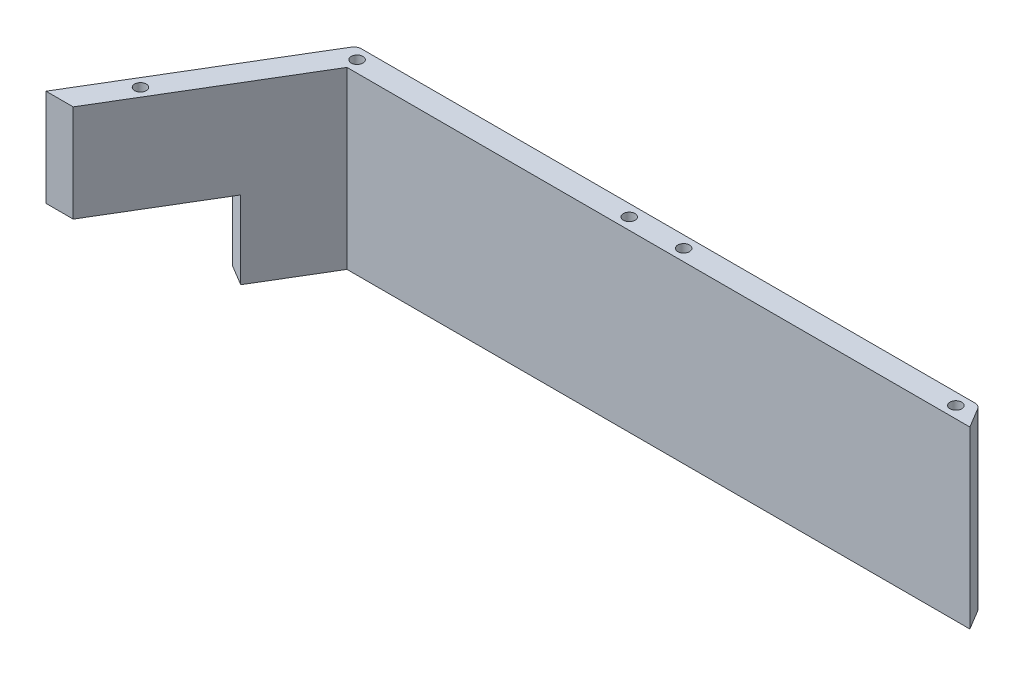
ISO-10303-21;
HEADER;
FILE_DESCRIPTION(('STEP AP214'),'2;1');
FILE_NAME('part.step','',(''),(''),'','','');
FILE_SCHEMA(('AUTOMOTIVE_DESIGN { 1 0 10303 214 1 1 1 1 }'));
ENDSEC;
DATA;
#1=APPLICATION_CONTEXT('core data for automotive mechanical design processes');
#2=APPLICATION_PROTOCOL_DEFINITION('international standard','automotive_design',2000,#1);
#3=PRODUCT_CONTEXT('',#1,'mechanical');
#4=PRODUCT('Part','Part','',(#3));
#5=PRODUCT_RELATED_PRODUCT_CATEGORY('part','',(#4));
#6=PRODUCT_DEFINITION_FORMATION('','',#4);
#7=PRODUCT_DEFINITION_CONTEXT('part definition',#1,'design');
#8=PRODUCT_DEFINITION('design','',#6,#7);
#9=PRODUCT_DEFINITION_SHAPE('','',#8);
#10=(LENGTH_UNIT() NAMED_UNIT(*) SI_UNIT(.MILLI.,.METRE.));
#11=(NAMED_UNIT(*) PLANE_ANGLE_UNIT() SI_UNIT($,.RADIAN.));
#12=(NAMED_UNIT(*) SI_UNIT($,.STERADIAN.) SOLID_ANGLE_UNIT());
#13=UNCERTAINTY_MEASURE_WITH_UNIT(LENGTH_MEASURE(1.E-05),#10,'distance_accuracy_value','');
#14=(GEOMETRIC_REPRESENTATION_CONTEXT(3) GLOBAL_UNCERTAINTY_ASSIGNED_CONTEXT((#13)) GLOBAL_UNIT_ASSIGNED_CONTEXT((#10,
#11,#12)) REPRESENTATION_CONTEXT('',''));
#15=CARTESIAN_POINT('',(0.,0.,0.));
#16=DIRECTION('',(0.,0.,1.));
#17=DIRECTION('',(1.,0.,0.));
#18=AXIS2_PLACEMENT_3D('',#15,#16,#17);
#19=CARTESIAN_POINT('',(0.,-22.5,0.));
#20=DIRECTION('',(0.,-1.,0.));
#21=DIRECTION('',(0.,0.,-1.));
#22=AXIS2_PLACEMENT_3D('',#19,#20,#21);
#23=PLANE('',#22);
#24=DIRECTION('',(-0.514495755427526,0.,-0.857492925712544));
#25=VECTOR('',#24,1.);
#26=CARTESIAN_POINT('',(110.,-22.5,1.76566830699974E-13));
#27=LINE('',#26,#25);
#28=CARTESIAN_POINT('',(83.6,-22.5,-43.9999999999998));
#29=VERTEX_POINT('',#28);
#30=CARTESIAN_POINT('',(80.582605093487,-22.5,-49.0289915108549));
#31=VERTEX_POINT('',#30);
#32=EDGE_CURVE('E146',#29,#31,#27,.T.);
#33=ORIENTED_EDGE('',*,*,#32,.F.);
#34=DIRECTION('',(1.,0.,0.));
#35=VECTOR('',#34,1.);
#36=CARTESIAN_POINT('',(76.6,-22.5,-43.9999999999998));
#37=LINE('',#36,#35);
#38=CARTESIAN_POINT('',(-76.6,-22.5,-43.9999999999998));
#39=VERTEX_POINT('',#38);
#40=EDGE_CURVE('E53',#39,#29,#37,.T.);
#41=ORIENTED_EDGE('',*,*,#40,.F.);
#42=DIRECTION('',(0.514495755427526,0.,-0.857492925712545));
#43=VECTOR('',#42,1.);
#44=CARTESIAN_POINT('',(-76.6,-22.5,-43.9999999999998));
#45=LINE('',#44,#43);
#46=CARTESIAN_POINT('',(-86.8455897365072,-22.5,-26.9240171058212));
#47=VERTEX_POINT('',#46);
#48=EDGE_CURVE('E143',#47,#39,#45,.T.);
#49=ORIENTED_EDGE('',*,*,#48,.F.);
#50=DIRECTION('',(-0.857492925712544,0.,-0.514495755427526));
#51=VECTOR('',#50,1.);
#52=CARTESIAN_POINT('',(-83.4177193029112,-22.5,-24.8672948456636));
#53=LINE('',#52,#51);
#54=CARTESIAN_POINT('',(-91.9926485600366,-22.5,-30.0122523999389));
#55=VERTEX_POINT('',#54);
#56=EDGE_CURVE('E50',#47,#55,#53,.T.);
#57=ORIENTED_EDGE('',*,*,#56,.T.);
#58=DIRECTION('',(-0.514495755427526,0.,0.857492925712544));
#59=VECTOR('',#58,1.);
#60=CARTESIAN_POINT('',(-110.,-22.5,1.76566830699974E-13));
#61=LINE('',#60,#59);
#62=CARTESIAN_POINT('',(-80.582605093487,-22.5,-49.0289915108549));
#63=VERTEX_POINT('',#62);
#64=EDGE_CURVE('E153',#63,#55,#61,.T.);
#65=ORIENTED_EDGE('',*,*,#64,.F.);
#66=CARTESIAN_POINT('',(-78.8676192420619,-22.5,-47.9999999999998));
#67=DIRECTION('',(0.,-1.,0.));
#68=DIRECTION('',(0.,0.,-1.));
#69=AXIS2_PLACEMENT_3D('',#66,#67,#68);
#70=CIRCLE('',#69,2.);
#71=CARTESIAN_POINT('',(-78.8676192420619,-22.5,-49.9999999999998));
#72=VERTEX_POINT('',#71);
#73=EDGE_CURVE('E167',#63,#72,#70,.T.);
#74=ORIENTED_EDGE('',*,*,#73,.T.);
#75=DIRECTION('',(-1.,0.,0.));
#76=VECTOR('',#75,1.);
#77=CARTESIAN_POINT('',(-80.,-22.5,-49.9999999999998));
#78=LINE('',#77,#76);
#79=CARTESIAN_POINT('',(78.8676192420619,-22.5,-49.9999999999998));
#80=VERTEX_POINT('',#79);
#81=EDGE_CURVE('E151',#80,#72,#78,.T.);
#82=ORIENTED_EDGE('',*,*,#81,.F.);
#83=CARTESIAN_POINT('',(78.8676192420619,-22.5,-47.9999999999998));
#84=DIRECTION('',(0.,-1.,0.));
#85=DIRECTION('',(0.,0.,-1.));
#86=AXIS2_PLACEMENT_3D('',#83,#84,#85);
#87=CIRCLE('',#86,2.);
#88=EDGE_CURVE('E175',#80,#31,#87,.T.);
#89=ORIENTED_EDGE('',*,*,#88,.T.);
#90=EDGE_LOOP('',(#33,#41,#49,#57,#65,#74,#82,#89));
#91=FACE_BOUND('',#90,.T.);
#92=ADVANCED_FACE('F39',(#91),#23,.T.);
#93=CARTESIAN_POINT('',(110.,22.5,1.76566830699974E-13));
#94=DIRECTION('',(-0.857492925712544,0.,0.514495755427526));
#95=DIRECTION('',(0.514495755427526,0.,0.857492925712544));
#96=AXIS2_PLACEMENT_3D('',#93,#94,#95);
#97=PLANE('',#96);
#98=DIRECTION('',(0.,1.,0.));
#99=VECTOR('',#98,1.);
#100=CARTESIAN_POINT('',(83.6,22.5,-43.9999999999998));
#101=LINE('',#100,#99);
#102=CARTESIAN_POINT('',(83.6,22.5,-43.9999999999998));
#103=VERTEX_POINT('',#102);
#104=EDGE_CURVE('E127',#29,#103,#101,.T.);
#105=ORIENTED_EDGE('',*,*,#104,.F.);
#106=ORIENTED_EDGE('',*,*,#32,.T.);
#107=DIRECTION('',(0.,-1.,0.));
#108=VECTOR('',#107,1.);
#109=CARTESIAN_POINT('',(80.582605093487,22.5,-49.0289915108549));
#110=LINE('',#109,#108);
#111=CARTESIAN_POINT('',(80.582605093487,22.5,-49.0289915108549));
#112=VERTEX_POINT('',#111);
#113=EDGE_CURVE('E133',#31,#112,#110,.F.);
#114=ORIENTED_EDGE('',*,*,#113,.T.);
#115=DIRECTION('',(-0.514495755427526,0.,-0.857492925712544));
#116=VECTOR('',#115,1.);
#117=CARTESIAN_POINT('',(110.,22.5,1.76566830699974E-13));
#118=LINE('',#117,#116);
#119=EDGE_CURVE('E119',#103,#112,#118,.T.);
#120=ORIENTED_EDGE('',*,*,#119,.F.);
#121=EDGE_LOOP('',(#105,#106,#114,#120));
#122=FACE_BOUND('',#121,.T.);
#123=ADVANCED_FACE('F132',(#122),#97,.F.);
#124=CARTESIAN_POINT('',(0.,22.5,0.));
#125=DIRECTION('',(0.,-1.,0.));
#126=DIRECTION('',(0.,0.,-1.));
#127=AXIS2_PLACEMENT_3D('',#124,#125,#126);
#128=PLANE('',#127);
#129=CARTESIAN_POINT('',(77.,22.5,-46.9999999999998));
#130=DIRECTION('',(0.,1.,0.));
#131=DIRECTION('',(0.,0.,-1.));
#132=AXIS2_PLACEMENT_3D('',#129,#130,#131);
#133=CIRCLE('',#132,1.5);
#134=CARTESIAN_POINT('',(77.,22.5,-48.4999999999998));
#135=VERTEX_POINT('',#134);
#136=EDGE_CURVE('E225',#135,#135,#133,.T.);
#137=ORIENTED_EDGE('',*,*,#136,.F.);
#138=EDGE_LOOP('',(#137));
#139=FACE_BOUND('',#138,.T.);
#140=CARTESIAN_POINT('',(7.00000000000001,22.5,-46.9999999999998));
#141=DIRECTION('',(0.,1.,0.));
#142=DIRECTION('',(0.,0.,-1.));
#143=AXIS2_PLACEMENT_3D('',#140,#141,#142);
#144=CIRCLE('',#143,1.5);
#145=CARTESIAN_POINT('',(7.00000000000001,22.5,-48.4999999999998));
#146=VERTEX_POINT('',#145);
#147=EDGE_CURVE('E216',#146,#146,#144,.T.);
#148=ORIENTED_EDGE('',*,*,#147,.F.);
#149=EDGE_LOOP('',(#148));
#150=FACE_BOUND('',#149,.T.);
#151=CARTESIAN_POINT('',(-7.00000000000001,22.5,-46.9999999999998));
#152=DIRECTION('',(0.,1.,0.));
#153=DIRECTION('',(0.,0.,1.));
#154=AXIS2_PLACEMENT_3D('',#151,#152,#153);
#155=CIRCLE('',#154,1.5);
#156=CARTESIAN_POINT('',(-7.00000000000001,22.5,-45.4999999999998));
#157=VERTEX_POINT('',#156);
#158=EDGE_CURVE('E208',#157,#157,#155,.T.);
#159=ORIENTED_EDGE('',*,*,#158,.F.);
#160=EDGE_LOOP('',(#159));
#161=FACE_BOUND('',#160,.T.);
#162=CARTESIAN_POINT('',(-77.,22.5,-46.9999999999998));
#163=DIRECTION('',(0.,1.,0.));
#164=DIRECTION('',(0.,0.,1.));
#165=AXIS2_PLACEMENT_3D('',#162,#163,#164);
#166=CIRCLE('',#165,1.5);
#167=CARTESIAN_POINT('',(-77.,22.5,-45.4999999999998));
#168=VERTEX_POINT('',#167);
#169=EDGE_CURVE('E203',#168,#168,#166,.T.);
#170=ORIENTED_EDGE('',*,*,#169,.F.);
#171=EDGE_LOOP('',(#170));
#172=FACE_BOUND('',#171,.T.);
#173=CARTESIAN_POINT('',(-98.7014288630928,22.5,-12.9999999999998));
#174=DIRECTION('',(0.,1.,0.));
#175=DIRECTION('',(0.,0.,1.));
#176=AXIS2_PLACEMENT_3D('',#173,#174,#175);
#177=CIRCLE('',#176,1.5);
#178=CARTESIAN_POINT('',(-98.7014288630928,22.5,-11.4999999999998));
#179=VERTEX_POINT('',#178);
#180=EDGE_CURVE('E201',#179,#179,#177,.T.);
#181=ORIENTED_EDGE('',*,*,#180,.F.);
#182=EDGE_LOOP('',(#181));
#183=FACE_BOUND('',#182,.T.);
#184=DIRECTION('',(1.,0.,0.));
#185=VECTOR('',#184,1.);
#186=CARTESIAN_POINT('',(76.6,22.5,-43.9999999999998));
#187=LINE('',#186,#185);
#188=CARTESIAN_POINT('',(-76.6,22.5,-43.9999999999998));
#189=VERTEX_POINT('',#188);
#190=EDGE_CURVE('E120',#189,#103,#187,.T.);
#191=ORIENTED_EDGE('',*,*,#190,.T.);
#192=ORIENTED_EDGE('',*,*,#119,.T.);
#193=CARTESIAN_POINT('',(78.8676192420619,22.5,-47.9999999999998));
#194=DIRECTION('',(0.,-1.,0.));
#195=DIRECTION('',(0.,0.,-1.));
#196=AXIS2_PLACEMENT_3D('',#193,#194,#195);
#197=CIRCLE('',#196,2.);
#198=CARTESIAN_POINT('',(78.8676192420619,22.5,-49.9999999999998));
#199=VERTEX_POINT('',#198);
#200=EDGE_CURVE('E178',#112,#199,#197,.F.);
#201=ORIENTED_EDGE('',*,*,#200,.T.);
#202=DIRECTION('',(-1.,0.,0.));
#203=VECTOR('',#202,1.);
#204=CARTESIAN_POINT('',(-80.,22.5,-49.9999999999998));
#205=LINE('',#204,#203);
#206=CARTESIAN_POINT('',(-78.8676192420619,22.5,-49.9999999999998));
#207=VERTEX_POINT('',#206);
#208=EDGE_CURVE('E136',#199,#207,#205,.T.);
#209=ORIENTED_EDGE('',*,*,#208,.T.);
#210=CARTESIAN_POINT('',(-78.8676192420619,22.5,-47.9999999999998));
#211=DIRECTION('',(0.,-1.,0.));
#212=DIRECTION('',(0.,0.,-1.));
#213=AXIS2_PLACEMENT_3D('',#210,#211,#212);
#214=CIRCLE('',#213,2.);
#215=CARTESIAN_POINT('',(-80.582605093487,22.5,-49.0289915108549));
#216=VERTEX_POINT('',#215);
#217=EDGE_CURVE('E176',#207,#216,#214,.F.);
#218=ORIENTED_EDGE('',*,*,#217,.T.);
#219=DIRECTION('',(-0.514495755427526,0.,0.857492925712544));
#220=VECTOR('',#219,1.);
#221=CARTESIAN_POINT('',(-110.,22.5,1.76566830699974E-13));
#222=LINE('',#221,#220);
#223=CARTESIAN_POINT('',(-110.,22.5,1.76566830699974E-13));
#224=VERTEX_POINT('',#223);
#225=EDGE_CURVE('E138',#216,#224,#222,.T.);
#226=ORIENTED_EDGE('',*,*,#225,.T.);
#227=DIRECTION('',(1.,0.,0.));
#228=VECTOR('',#227,1.);
#229=CARTESIAN_POINT('',(-103.,22.5,1.75709577940571E-13));
#230=LINE('',#229,#228);
#231=CARTESIAN_POINT('',(-103.,22.5,1.75709577940571E-13));
#232=VERTEX_POINT('',#231);
#233=EDGE_CURVE('E160',#224,#232,#230,.T.);
#234=ORIENTED_EDGE('',*,*,#233,.T.);
#235=DIRECTION('',(0.514495755427526,0.,-0.857492925712545));
#236=VECTOR('',#235,1.);
#237=CARTESIAN_POINT('',(-76.6,22.5,-43.9999999999998));
#238=LINE('',#237,#236);
#239=EDGE_CURVE('E124',#232,#189,#238,.T.);
#240=ORIENTED_EDGE('',*,*,#239,.T.);
#241=EDGE_LOOP('',(#191,#192,#201,#209,#218,#226,#234,#240));
#242=FACE_BOUND('',#241,.T.);
#243=ADVANCED_FACE('F117',(#139,#150,#161,#172,#183,#242),#128,.F.);
#244=CARTESIAN_POINT('',(-110.,22.5,1.76566830699974E-13));
#245=DIRECTION('',(0.857492925712544,0.,0.514495755427526));
#246=DIRECTION('',(0.514495755427526,0.,-0.857492925712544));
#247=AXIS2_PLACEMENT_3D('',#244,#245,#246);
#248=PLANE('',#247);
#249=DIRECTION('',(0.,-1.,0.));
#250=VECTOR('',#249,1.);
#251=CARTESIAN_POINT('',(-91.9926485600366,-22.5,-30.0122523999389));
#252=LINE('',#251,#250);
#253=CARTESIAN_POINT('',(-91.9926485600366,-2.50000000000001,-30.0122523999389));
#254=VERTEX_POINT('',#253);
#255=EDGE_CURVE('E128',#254,#55,#252,.T.);
#256=ORIENTED_EDGE('',*,*,#255,.F.);
#257=DIRECTION('',(0.514495755427526,0.,-0.857492925712544));
#258=VECTOR('',#257,1.);
#259=CARTESIAN_POINT('',(-110.,-2.5,1.73472347597681E-13));
#260=LINE('',#259,#258);
#261=CARTESIAN_POINT('',(-110.,-2.5,1.73472347597681E-13));
#262=VERTEX_POINT('',#261);
#263=EDGE_CURVE('E250',#262,#254,#260,.T.);
#264=ORIENTED_EDGE('',*,*,#263,.F.);
#265=DIRECTION('',(0.,-1.,0.));
#266=VECTOR('',#265,1.);
#267=CARTESIAN_POINT('',(-110.,22.5,1.76566830699974E-13));
#268=LINE('',#267,#266);
#269=EDGE_CURVE('E144',#224,#262,#268,.T.);
#270=ORIENTED_EDGE('',*,*,#269,.F.);
#271=ORIENTED_EDGE('',*,*,#225,.F.);
#272=DIRECTION('',(0.,-1.,0.));
#273=VECTOR('',#272,1.);
#274=CARTESIAN_POINT('',(-80.582605093487,22.5,-49.0289915108549));
#275=LINE('',#274,#273);
#276=EDGE_CURVE('E177',#216,#63,#275,.T.);
#277=ORIENTED_EDGE('',*,*,#276,.T.);
#278=ORIENTED_EDGE('',*,*,#64,.T.);
#279=EDGE_LOOP('',(#256,#264,#270,#271,#277,#278));
#280=FACE_BOUND('',#279,.T.);
#281=ADVANCED_FACE('F244',(#280),#248,.F.);
#282=CARTESIAN_POINT('',(-103.,22.5,1.75709577940571E-13));
#283=DIRECTION('',(0.,0.,-1.));
#284=DIRECTION('',(-1.,0.,0.));
#285=AXIS2_PLACEMENT_3D('',#282,#283,#284);
#286=PLANE('',#285);
#287=ORIENTED_EDGE('',*,*,#269,.T.);
#288=DIRECTION('',(1.,0.,0.));
#289=VECTOR('',#288,1.);
#290=CARTESIAN_POINT('',(-103.,-2.5,1.75709577940571E-13));
#291=LINE('',#290,#289);
#292=CARTESIAN_POINT('',(-103.,-2.5,1.73472347597681E-13));
#293=VERTEX_POINT('',#292);
#294=EDGE_CURVE('E193',#262,#293,#291,.T.);
#295=ORIENTED_EDGE('',*,*,#294,.T.);
#296=DIRECTION('',(0.,-1.,0.));
#297=VECTOR('',#296,1.);
#298=CARTESIAN_POINT('',(-103.,22.5,1.75709577940571E-13));
#299=LINE('',#298,#297);
#300=EDGE_CURVE('E162',#232,#293,#299,.T.);
#301=ORIENTED_EDGE('',*,*,#300,.F.);
#302=ORIENTED_EDGE('',*,*,#233,.F.);
#303=EDGE_LOOP('',(#287,#295,#301,#302));
#304=FACE_BOUND('',#303,.T.);
#305=ADVANCED_FACE('F233',(#304),#286,.F.);
#306=CARTESIAN_POINT('',(-76.6,22.5,-43.9999999999998));
#307=DIRECTION('',(-0.857492925712545,0.,-0.514495755427526));
#308=DIRECTION('',(-0.514495755427526,0.,0.857492925712545));
#309=AXIS2_PLACEMENT_3D('',#306,#307,#308);
#310=PLANE('',#309);
#311=DIRECTION('',(0.514495755427526,0.,-0.857492925712545));
#312=VECTOR('',#311,1.);
#313=CARTESIAN_POINT('',(-76.6,-2.50000000000001,-43.9999999999998));
#314=LINE('',#313,#312);
#315=CARTESIAN_POINT('',(-86.8455897365072,-2.50000000000001,-26.9240171058212));
#316=VERTEX_POINT('',#315);
#317=EDGE_CURVE('E11',#293,#316,#314,.T.);
#318=ORIENTED_EDGE('',*,*,#317,.T.);
#319=DIRECTION('',(0.,-1.,0.));
#320=VECTOR('',#319,1.);
#321=CARTESIAN_POINT('',(-86.8455897365072,22.5,-26.9240171058212));
#322=LINE('',#321,#320);
#323=EDGE_CURVE('E195',#316,#47,#322,.T.);
#324=ORIENTED_EDGE('',*,*,#323,.T.);
#325=ORIENTED_EDGE('',*,*,#48,.T.);
#326=DIRECTION('',(0.,-1.,0.));
#327=VECTOR('',#326,1.);
#328=CARTESIAN_POINT('',(-76.6,22.5,-43.9999999999998));
#329=LINE('',#328,#327);
#330=EDGE_CURVE('E159',#189,#39,#329,.T.);
#331=ORIENTED_EDGE('',*,*,#330,.F.);
#332=ORIENTED_EDGE('',*,*,#239,.F.);
#333=ORIENTED_EDGE('',*,*,#300,.T.);
#334=EDGE_LOOP('',(#318,#324,#325,#331,#332,#333));
#335=FACE_BOUND('',#334,.T.);
#336=ADVANCED_FACE('F231',(#335),#310,.F.);
#337=CARTESIAN_POINT('',(76.6,22.5,-43.9999999999998));
#338=DIRECTION('',(0.,0.,-1.));
#339=DIRECTION('',(-1.,0.,0.));
#340=AXIS2_PLACEMENT_3D('',#337,#338,#339);
#341=PLANE('',#340);
#342=ORIENTED_EDGE('',*,*,#40,.T.);
#343=ORIENTED_EDGE('',*,*,#104,.T.);
#344=ORIENTED_EDGE('',*,*,#190,.F.);
#345=ORIENTED_EDGE('',*,*,#330,.T.);
#346=EDGE_LOOP('',(#342,#343,#344,#345));
#347=FACE_BOUND('',#346,.T.);
#348=ADVANCED_FACE('F130',(#347),#341,.F.);
#349=CARTESIAN_POINT('',(-80.,22.5,-49.9999999999998));
#350=DIRECTION('',(0.,0.,1.));
#351=DIRECTION('',(1.,0.,0.));
#352=AXIS2_PLACEMENT_3D('',#349,#350,#351);
#353=PLANE('',#352);
#354=ORIENTED_EDGE('',*,*,#208,.F.);
#355=DIRECTION('',(0.,-1.,0.));
#356=VECTOR('',#355,1.);
#357=CARTESIAN_POINT('',(78.8676192420619,22.5,-49.9999999999998));
#358=LINE('',#357,#356);
#359=EDGE_CURVE('E170',#199,#80,#358,.T.);
#360=ORIENTED_EDGE('',*,*,#359,.T.);
#361=ORIENTED_EDGE('',*,*,#81,.T.);
#362=DIRECTION('',(0.,-1.,0.));
#363=VECTOR('',#362,1.);
#364=CARTESIAN_POINT('',(-78.8676192420619,22.5,-49.9999999999998));
#365=LINE('',#364,#363);
#366=EDGE_CURVE('E164',#72,#207,#365,.F.);
#367=ORIENTED_EDGE('',*,*,#366,.T.);
#368=EDGE_LOOP('',(#354,#360,#361,#367));
#369=FACE_BOUND('',#368,.T.);
#370=ADVANCED_FACE('F241',(#369),#353,.F.);
#371=CARTESIAN_POINT('',(77.,17.5,-46.9999999999998));
#372=DIRECTION('',(0.,1.,0.));
#373=DIRECTION('',(0.,0.,1.));
#374=AXIS2_PLACEMENT_3D('',#371,#372,#373);
#375=CYLINDRICAL_SURFACE('',#374,1.5);
#376=CARTESIAN_POINT('',(77.,17.5,-46.9999999999998));
#377=DIRECTION('',(0.,1.,0.));
#378=DIRECTION('',(0.,0.,-1.));
#379=AXIS2_PLACEMENT_3D('',#376,#377,#378);
#380=CIRCLE('',#379,1.5);
#381=CARTESIAN_POINT('',(77.,17.5,-48.4999999999998));
#382=VERTEX_POINT('',#381);
#383=EDGE_CURVE('E199',#382,#382,#380,.T.);
#384=ORIENTED_EDGE('',*,*,#383,.F.);
#385=EDGE_LOOP('',(#384));
#386=FACE_BOUND('',#385,.T.);
#387=ORIENTED_EDGE('',*,*,#136,.T.);
#388=EDGE_LOOP('',(#387));
#389=FACE_BOUND('',#388,.T.);
#390=ADVANCED_FACE('F272',(#386,#389),#375,.F.);
#391=CARTESIAN_POINT('',(77.,17.5,-46.9999999999998));
#392=DIRECTION('',(0.,-1.,0.));
#393=DIRECTION('',(0.,0.,-1.));
#394=AXIS2_PLACEMENT_3D('',#391,#392,#393);
#395=PLANE('',#394);
#396=ORIENTED_EDGE('',*,*,#383,.T.);
#397=EDGE_LOOP('',(#396));
#398=FACE_BOUND('',#397,.T.);
#399=ADVANCED_FACE('F315',(#398),#395,.F.);
#400=CARTESIAN_POINT('',(7.00000000000001,17.5,-46.9999999999998));
#401=DIRECTION('',(0.,1.,0.));
#402=DIRECTION('',(0.,0.,1.));
#403=AXIS2_PLACEMENT_3D('',#400,#401,#402);
#404=CYLINDRICAL_SURFACE('',#403,1.5);
#405=CARTESIAN_POINT('',(7.00000000000001,17.5,-46.9999999999998));
#406=DIRECTION('',(0.,1.,0.));
#407=DIRECTION('',(0.,0.,-1.));
#408=AXIS2_PLACEMENT_3D('',#405,#406,#407);
#409=CIRCLE('',#408,1.5);
#410=CARTESIAN_POINT('',(7.00000000000001,17.5,-48.4999999999998));
#411=VERTEX_POINT('',#410);
#412=EDGE_CURVE('E218',#411,#411,#409,.T.);
#413=ORIENTED_EDGE('',*,*,#412,.F.);
#414=EDGE_LOOP('',(#413));
#415=FACE_BOUND('',#414,.T.);
#416=ORIENTED_EDGE('',*,*,#147,.T.);
#417=EDGE_LOOP('',(#416));
#418=FACE_BOUND('',#417,.T.);
#419=ADVANCED_FACE('F307',(#415,#418),#404,.F.);
#420=CARTESIAN_POINT('',(7.00000000000001,17.5,-46.9999999999998));
#421=DIRECTION('',(0.,-1.,0.));
#422=DIRECTION('',(0.,0.,-1.));
#423=AXIS2_PLACEMENT_3D('',#420,#421,#422);
#424=PLANE('',#423);
#425=ORIENTED_EDGE('',*,*,#412,.T.);
#426=EDGE_LOOP('',(#425));
#427=FACE_BOUND('',#426,.T.);
#428=ADVANCED_FACE('F302',(#427),#424,.F.);
#429=CARTESIAN_POINT('',(-7.00000000000001,17.5,-46.9999999999998));
#430=DIRECTION('',(0.,1.,0.));
#431=DIRECTION('',(0.,0.,1.));
#432=AXIS2_PLACEMENT_3D('',#429,#430,#431);
#433=CYLINDRICAL_SURFACE('',#432,1.5);
#434=CARTESIAN_POINT('',(-7.00000000000001,17.5,-46.9999999999998));
#435=DIRECTION('',(0.,1.,0.));
#436=DIRECTION('',(0.,0.,1.));
#437=AXIS2_PLACEMENT_3D('',#434,#435,#436);
#438=CIRCLE('',#437,1.5);
#439=CARTESIAN_POINT('',(-7.00000000000001,17.5,-45.4999999999998));
#440=VERTEX_POINT('',#439);
#441=EDGE_CURVE('E214',#440,#440,#438,.T.);
#442=ORIENTED_EDGE('',*,*,#441,.F.);
#443=EDGE_LOOP('',(#442));
#444=FACE_BOUND('',#443,.T.);
#445=ORIENTED_EDGE('',*,*,#158,.T.);
#446=EDGE_LOOP('',(#445));
#447=FACE_BOUND('',#446,.T.);
#448=ADVANCED_FACE('F301',(#444,#447),#433,.F.);
#449=CARTESIAN_POINT('',(-7.00000000000001,17.5,-46.9999999999998));
#450=DIRECTION('',(0.,1.,0.));
#451=DIRECTION('',(0.,0.,1.));
#452=AXIS2_PLACEMENT_3D('',#449,#450,#451);
#453=PLANE('',#452);
#454=ORIENTED_EDGE('',*,*,#441,.T.);
#455=EDGE_LOOP('',(#454));
#456=FACE_BOUND('',#455,.T.);
#457=ADVANCED_FACE('F298',(#456),#453,.T.);
#458=CARTESIAN_POINT('',(-77.,17.5,-46.9999999999998));
#459=DIRECTION('',(0.,1.,0.));
#460=DIRECTION('',(0.,0.,1.));
#461=AXIS2_PLACEMENT_3D('',#458,#459,#460);
#462=CYLINDRICAL_SURFACE('',#461,1.5);
#463=CARTESIAN_POINT('',(-77.,17.5,-46.9999999999998));
#464=DIRECTION('',(0.,1.,0.));
#465=DIRECTION('',(0.,0.,1.));
#466=AXIS2_PLACEMENT_3D('',#463,#464,#465);
#467=CIRCLE('',#466,1.5);
#468=CARTESIAN_POINT('',(-77.,17.5,-45.4999999999998));
#469=VERTEX_POINT('',#468);
#470=EDGE_CURVE('E210',#469,#469,#467,.T.);
#471=ORIENTED_EDGE('',*,*,#470,.F.);
#472=EDGE_LOOP('',(#471));
#473=FACE_BOUND('',#472,.T.);
#474=ORIENTED_EDGE('',*,*,#169,.T.);
#475=EDGE_LOOP('',(#474));
#476=FACE_BOUND('',#475,.T.);
#477=ADVANCED_FACE('F291',(#473,#476),#462,.F.);
#478=CARTESIAN_POINT('',(-77.,17.5,-46.9999999999998));
#479=DIRECTION('',(0.,1.,0.));
#480=DIRECTION('',(0.,0.,1.));
#481=AXIS2_PLACEMENT_3D('',#478,#479,#480);
#482=PLANE('',#481);
#483=ORIENTED_EDGE('',*,*,#470,.T.);
#484=EDGE_LOOP('',(#483));
#485=FACE_BOUND('',#484,.T.);
#486=ADVANCED_FACE('F288',(#485),#482,.T.);
#487=CARTESIAN_POINT('',(-98.7014288630928,17.5,-12.9999999999998));
#488=DIRECTION('',(0.,1.,0.));
#489=DIRECTION('',(0.,0.,1.));
#490=AXIS2_PLACEMENT_3D('',#487,#488,#489);
#491=CYLINDRICAL_SURFACE('',#490,1.5);
#492=CARTESIAN_POINT('',(-98.7014288630928,17.5,-12.9999999999998));
#493=DIRECTION('',(0.,1.,0.));
#494=DIRECTION('',(0.,0.,1.));
#495=AXIS2_PLACEMENT_3D('',#492,#493,#494);
#496=CIRCLE('',#495,1.5);
#497=CARTESIAN_POINT('',(-98.7014288630928,17.5,-11.4999999999998));
#498=VERTEX_POINT('',#497);
#499=EDGE_CURVE('E150',#498,#498,#496,.T.);
#500=ORIENTED_EDGE('',*,*,#499,.F.);
#501=EDGE_LOOP('',(#500));
#502=FACE_BOUND('',#501,.T.);
#503=ORIENTED_EDGE('',*,*,#180,.T.);
#504=EDGE_LOOP('',(#503));
#505=FACE_BOUND('',#504,.T.);
#506=ADVANCED_FACE('F283',(#502,#505),#491,.F.);
#507=CARTESIAN_POINT('',(-98.7014288630928,17.5,-12.9999999999998));
#508=DIRECTION('',(0.,1.,0.));
#509=DIRECTION('',(0.,0.,1.));
#510=AXIS2_PLACEMENT_3D('',#507,#508,#509);
#511=PLANE('',#510);
#512=ORIENTED_EDGE('',*,*,#499,.T.);
#513=EDGE_LOOP('',(#512));
#514=FACE_BOUND('',#513,.T.);
#515=ADVANCED_FACE('F276',(#514),#511,.T.);
#516=CARTESIAN_POINT('',(78.8676192420619,22.5,-47.9999999999998));
#517=DIRECTION('',(0.,-1.,0.));
#518=DIRECTION('',(0.,0.,-1.));
#519=AXIS2_PLACEMENT_3D('',#516,#517,#518);
#520=CYLINDRICAL_SURFACE('',#519,2.);
#521=ORIENTED_EDGE('',*,*,#200,.F.);
#522=ORIENTED_EDGE('',*,*,#113,.F.);
#523=ORIENTED_EDGE('',*,*,#88,.F.);
#524=ORIENTED_EDGE('',*,*,#359,.F.);
#525=EDGE_LOOP('',(#521,#522,#523,#524));
#526=FACE_BOUND('',#525,.T.);
#527=ADVANCED_FACE('F240',(#526),#520,.T.);
#528=CARTESIAN_POINT('',(-78.8676192420619,22.5,-47.9999999999998));
#529=DIRECTION('',(0.,-1.,0.));
#530=DIRECTION('',(0.,0.,-1.));
#531=AXIS2_PLACEMENT_3D('',#528,#529,#530);
#532=CYLINDRICAL_SURFACE('',#531,2.);
#533=ORIENTED_EDGE('',*,*,#217,.F.);
#534=ORIENTED_EDGE('',*,*,#366,.F.);
#535=ORIENTED_EDGE('',*,*,#73,.F.);
#536=ORIENTED_EDGE('',*,*,#276,.F.);
#537=EDGE_LOOP('',(#533,#534,#535,#536));
#538=FACE_BOUND('',#537,.T.);
#539=ADVANCED_FACE('F41',(#538),#532,.T.);
#540=CARTESIAN_POINT('',(-101.425070742875,-2.5,5.14495755427544));
#541=DIRECTION('',(0.,1.,0.));
#542=DIRECTION('',(0.,0.,1.));
#543=AXIS2_PLACEMENT_3D('',#540,#541,#542);
#544=PLANE('',#543);
#545=ORIENTED_EDGE('',*,*,#263,.T.);
#546=DIRECTION('',(-0.857492925712544,0.,-0.514495755427526));
#547=VECTOR('',#546,1.);
#548=CARTESIAN_POINT('',(-83.4177193029112,-2.50000000000001,-24.8672948456636));
#549=LINE('',#548,#547);
#550=EDGE_CURVE('E65',#316,#254,#549,.T.);
#551=ORIENTED_EDGE('',*,*,#550,.F.);
#552=ORIENTED_EDGE('',*,*,#317,.F.);
#553=ORIENTED_EDGE('',*,*,#294,.F.);
#554=EDGE_LOOP('',(#545,#551,#552,#553));
#555=FACE_BOUND('',#554,.T.);
#556=ADVANCED_FACE('F255',(#555),#544,.F.);
#557=CARTESIAN_POINT('',(-83.4177193029112,-22.5,-24.8672948456636));
#558=DIRECTION('',(0.514495755427526,0.,-0.857492925712544));
#559=DIRECTION('',(-0.857492925712544,0.,-0.514495755427526));
#560=AXIS2_PLACEMENT_3D('',#557,#558,#559);
#561=PLANE('',#560);
#562=ORIENTED_EDGE('',*,*,#550,.T.);
#563=ORIENTED_EDGE('',*,*,#255,.T.);
#564=ORIENTED_EDGE('',*,*,#56,.F.);
#565=ORIENTED_EDGE('',*,*,#323,.F.);
#566=EDGE_LOOP('',(#562,#563,#564,#565));
#567=FACE_BOUND('',#566,.T.);
#568=ADVANCED_FACE('F249',(#567),#561,.F.);
#569=CLOSED_SHELL('',(#92,#123,#243,#281,#305,#336,#348,#370,#390,#399,#419,#428,#448,#457,#477,
#486,#506,#515,#527,#539,#556,#568));
#570=MANIFOLD_SOLID_BREP('B2',#569);
#571=ADVANCED_BREP_SHAPE_REPRESENTATION('',(#18,#570),#14);
#572=SHAPE_DEFINITION_REPRESENTATION(#9,#571);
ENDSEC;
END-ISO-10303-21;
